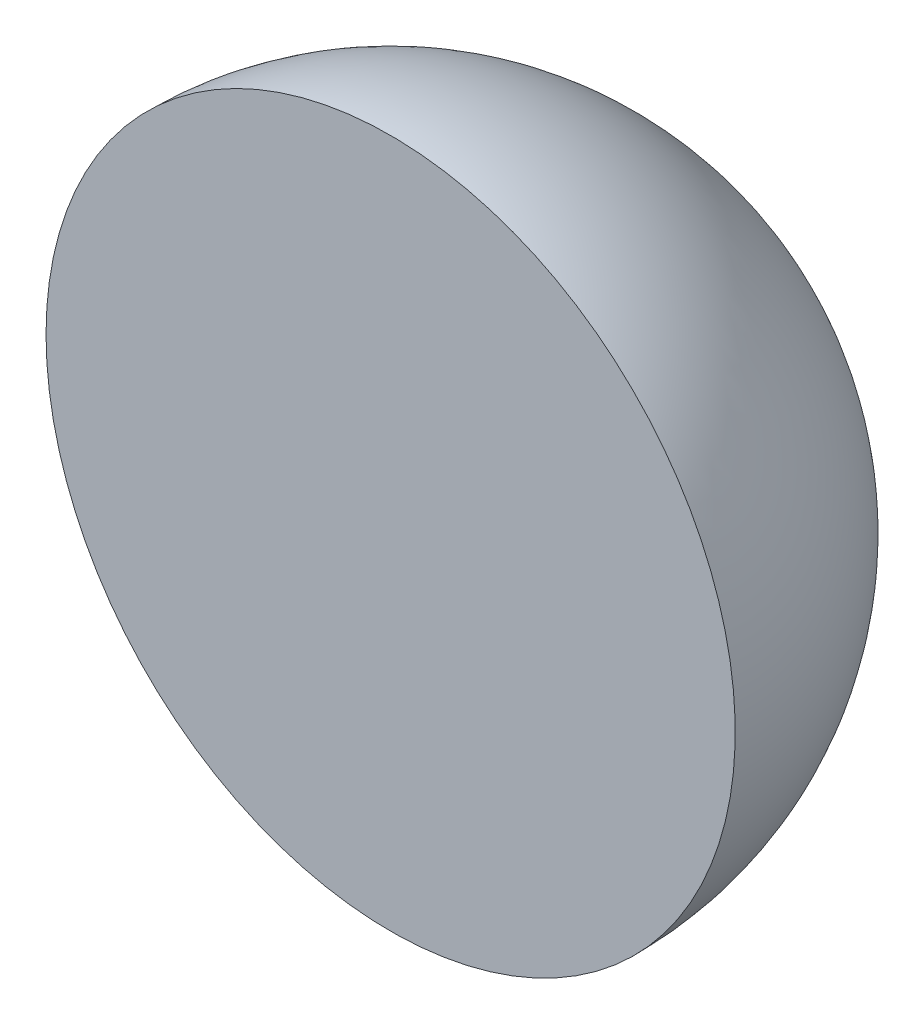
ISO-10303-21;
HEADER;
FILE_DESCRIPTION(('STEP AP214'),'2;1');
FILE_NAME('part.step','',(''),(''),'','','');
FILE_SCHEMA(('AUTOMOTIVE_DESIGN { 1 0 10303 214 1 1 1 1 }'));
ENDSEC;
DATA;
#1=APPLICATION_CONTEXT('core data for automotive mechanical design processes');
#2=APPLICATION_PROTOCOL_DEFINITION('international standard','automotive_design',2000,#1);
#3=PRODUCT_CONTEXT('',#1,'mechanical');
#4=PRODUCT('Part','Part','',(#3));
#5=PRODUCT_RELATED_PRODUCT_CATEGORY('part','',(#4));
#6=PRODUCT_DEFINITION_FORMATION('','',#4);
#7=PRODUCT_DEFINITION_CONTEXT('part definition',#1,'design');
#8=PRODUCT_DEFINITION('design','',#6,#7);
#9=PRODUCT_DEFINITION_SHAPE('','',#8);
#10=(LENGTH_UNIT() NAMED_UNIT(*) SI_UNIT(.MILLI.,.METRE.));
#11=(NAMED_UNIT(*) PLANE_ANGLE_UNIT() SI_UNIT($,.RADIAN.));
#12=(NAMED_UNIT(*) SI_UNIT($,.STERADIAN.) SOLID_ANGLE_UNIT());
#13=UNCERTAINTY_MEASURE_WITH_UNIT(LENGTH_MEASURE(1.E-05),#10,'distance_accuracy_value','');
#14=(GEOMETRIC_REPRESENTATION_CONTEXT(3) GLOBAL_UNCERTAINTY_ASSIGNED_CONTEXT((#13)) GLOBAL_UNIT_ASSIGNED_CONTEXT((#10,
#11,#12)) REPRESENTATION_CONTEXT('',''));
#15=CARTESIAN_POINT('',(0.,0.,0.));
#16=DIRECTION('',(0.,0.,1.));
#17=DIRECTION('',(1.,0.,0.));
#18=AXIS2_PLACEMENT_3D('',#15,#16,#17);
#19=CARTESIAN_POINT('',(-0.000140289903107632,0.,0.));
#20=DIRECTION('',(0.,-1.,0.));
#21=DIRECTION('',(-1.,0.,0.));
#22=AXIS2_PLACEMENT_3D('',#19,#20,#21);
#23=CIRCLE('',#22,4.99992985591816);
#24=TRIMMED_CURVE('',#23,(PARAMETER_VALUE(-1.57081035598202)),
(PARAMETER_VALUE(1.57081035598202)),.T.,.PARAMETER.);
#25=CARTESIAN_POINT('',(-7.0144951553816E-05,0.,0.));
#26=DIRECTION('',(0.,0.,-1.));
#27=AXIS1_PLACEMENT('',#25,#26);
#28=SURFACE_OF_REVOLUTION('',#24,#27);
#29=CARTESIAN_POINT('',(-7.01449515544284E-05,0.,-4.99992985542612));
#30=VERTEX_POINT('',#29);
#31=VERTEX_LOOP('',#30);
#32=FACE_BOUND('',#31,.T.);
#33=CARTESIAN_POINT('',(-7.01449515538161E-05,0.,-9.32578462613243E-05));
#34=DIRECTION('',(0.,0.,-1.));
#35=DIRECTION('',(-1.,0.,0.));
#36=AXIS2_PLACEMENT_3D('',#33,#34,#35);
#37=CIRCLE('',#36,5.);
#38=CARTESIAN_POINT('',(-5.00007014495155,0.,-9.32578462607119E-05));
#39=VERTEX_POINT('',#38);
#40=EDGE_CURVE('E11',#39,#39,#37,.T.);
#41=ORIENTED_EDGE('',*,*,#40,.T.);
#42=EDGE_LOOP('',(#41));
#43=FACE_BOUND('',#42,.T.);
#44=ADVANCED_FACE('F35',(#32,#43),#28,.T.);
#45=CARTESIAN_POINT('',(0.,0.,-9.32578462613623E-05));
#46=DIRECTION('',(0.,0.,1.));
#47=DIRECTION('',(1.,0.,0.));
#48=AXIS2_PLACEMENT_3D('',#45,#46,#47);
#49=PLANE('',#48);
#50=ORIENTED_EDGE('',*,*,#40,.F.);
#51=EDGE_LOOP('',(#50));
#52=FACE_BOUND('',#51,.T.);
#53=ADVANCED_FACE('F44',(#52),#49,.T.);
#54=CLOSED_SHELL('',(#44,#53));
#55=MANIFOLD_SOLID_BREP('B2',#54);
#56=ADVANCED_BREP_SHAPE_REPRESENTATION('',(#18,#55),#14);
#57=SHAPE_DEFINITION_REPRESENTATION(#9,#56);
ENDSEC;
END-ISO-10303-21;
